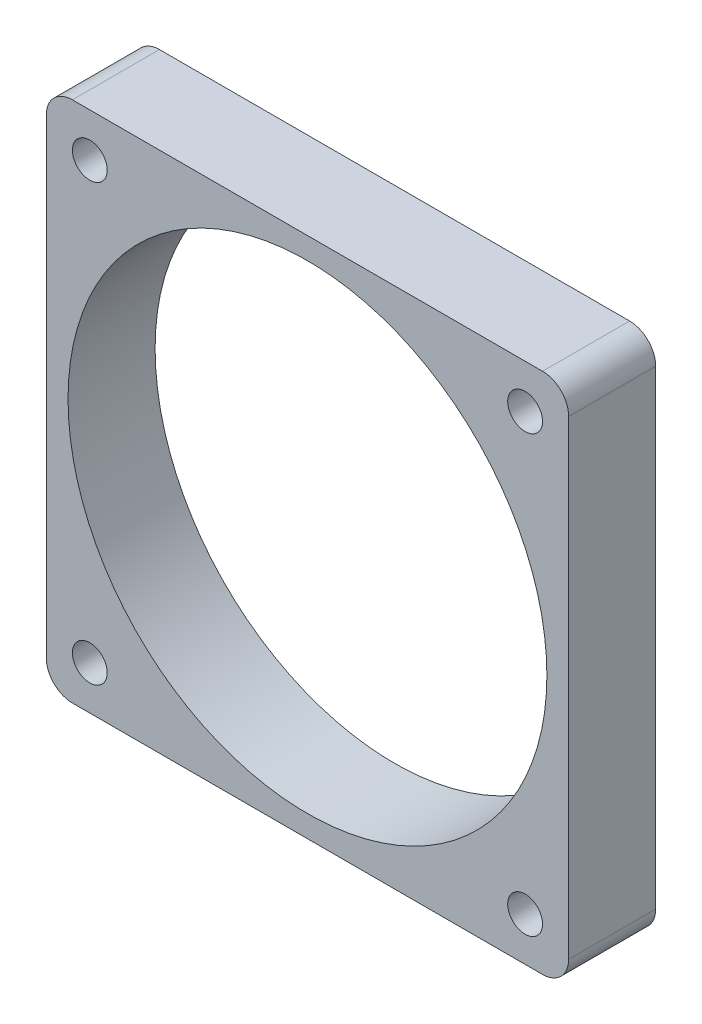
ISO-10303-21;
HEADER;
FILE_DESCRIPTION(('STEP AP214'),'2;1');
FILE_NAME('part.step','',(''),(''),'','','');
FILE_SCHEMA(('AUTOMOTIVE_DESIGN { 1 0 10303 214 1 1 1 1 }'));
ENDSEC;
DATA;
#1=APPLICATION_CONTEXT('core data for automotive mechanical design processes');
#2=APPLICATION_PROTOCOL_DEFINITION('international standard','automotive_design',2000,#1);
#3=PRODUCT_CONTEXT('',#1,'mechanical');
#4=PRODUCT('Part','Part','',(#3));
#5=PRODUCT_RELATED_PRODUCT_CATEGORY('part','',(#4));
#6=PRODUCT_DEFINITION_FORMATION('','',#4);
#7=PRODUCT_DEFINITION_CONTEXT('part definition',#1,'design');
#8=PRODUCT_DEFINITION('design','',#6,#7);
#9=PRODUCT_DEFINITION_SHAPE('','',#8);
#10=(LENGTH_UNIT() NAMED_UNIT(*) SI_UNIT(.MILLI.,.METRE.));
#11=(NAMED_UNIT(*) PLANE_ANGLE_UNIT() SI_UNIT($,.RADIAN.));
#12=(NAMED_UNIT(*) SI_UNIT($,.STERADIAN.) SOLID_ANGLE_UNIT());
#13=UNCERTAINTY_MEASURE_WITH_UNIT(LENGTH_MEASURE(1.E-05),#10,'distance_accuracy_value','');
#14=(GEOMETRIC_REPRESENTATION_CONTEXT(3) GLOBAL_UNCERTAINTY_ASSIGNED_CONTEXT((#13)) GLOBAL_UNIT_ASSIGNED_CONTEXT((#10,
#11,#12)) REPRESENTATION_CONTEXT('',''));
#15=CARTESIAN_POINT('',(0.,0.,0.));
#16=DIRECTION('',(0.,0.,1.));
#17=DIRECTION('',(1.,0.,0.));
#18=AXIS2_PLACEMENT_3D('',#15,#16,#17);
#19=CARTESIAN_POINT('',(0.,0.,10.));
#20=DIRECTION('',(0.,0.,-1.));
#21=DIRECTION('',(-1.,0.,0.));
#22=AXIS2_PLACEMENT_3D('',#19,#20,#21);
#23=PLANE('',#22);
#24=CARTESIAN_POINT('',(25.,25.,10.));
#25=DIRECTION('',(0.,0.,1.));
#26=DIRECTION('',(1.,0.,0.));
#27=AXIS2_PLACEMENT_3D('',#24,#25,#26);
#28=CIRCLE('',#27,2.);
#29=CARTESIAN_POINT('',(27.,25.,10.));
#30=VERTEX_POINT('',#29);
#31=EDGE_CURVE('E184',#30,#30,#28,.T.);
#32=ORIENTED_EDGE('',*,*,#31,.F.);
#33=EDGE_LOOP('',(#32));
#34=FACE_BOUND('',#33,.T.);
#35=CARTESIAN_POINT('',(-25.,-25.,10.));
#36=DIRECTION('',(0.,0.,1.));
#37=DIRECTION('',(1.,0.,0.));
#38=AXIS2_PLACEMENT_3D('',#35,#36,#37);
#39=CIRCLE('',#38,2.);
#40=CARTESIAN_POINT('',(-23.,-25.,10.));
#41=VERTEX_POINT('',#40);
#42=EDGE_CURVE('E176',#41,#41,#39,.T.);
#43=ORIENTED_EDGE('',*,*,#42,.F.);
#44=EDGE_LOOP('',(#43));
#45=FACE_BOUND('',#44,.T.);
#46=CARTESIAN_POINT('',(25.,-25.,10.));
#47=DIRECTION('',(0.,0.,1.));
#48=DIRECTION('',(1.,0.,0.));
#49=AXIS2_PLACEMENT_3D('',#46,#47,#48);
#50=CIRCLE('',#49,2.);
#51=CARTESIAN_POINT('',(27.,-25.,10.));
#52=VERTEX_POINT('',#51);
#53=EDGE_CURVE('E174',#52,#52,#50,.T.);
#54=ORIENTED_EDGE('',*,*,#53,.F.);
#55=EDGE_LOOP('',(#54));
#56=FACE_BOUND('',#55,.T.);
#57=CARTESIAN_POINT('',(-25.,25.,10.));
#58=DIRECTION('',(0.,0.,1.));
#59=DIRECTION('',(1.,0.,0.));
#60=AXIS2_PLACEMENT_3D('',#57,#58,#59);
#61=CIRCLE('',#60,2.);
#62=CARTESIAN_POINT('',(-23.,25.,10.));
#63=VERTEX_POINT('',#62);
#64=EDGE_CURVE('E170',#63,#63,#61,.T.);
#65=ORIENTED_EDGE('',*,*,#64,.F.);
#66=EDGE_LOOP('',(#65));
#67=FACE_BOUND('',#66,.T.);
#68=DIRECTION('',(1.,0.,0.));
#69=VECTOR('',#68,1.);
#70=CARTESIAN_POINT('',(-30.,-30.,10.));
#71=LINE('',#70,#69);
#72=CARTESIAN_POINT('',(-27.,-30.,10.));
#73=VERTEX_POINT('',#72);
#74=CARTESIAN_POINT('',(27.,-30.,10.));
#75=VERTEX_POINT('',#74);
#76=EDGE_CURVE('E120',#73,#75,#71,.T.);
#77=ORIENTED_EDGE('',*,*,#76,.T.);
#78=CARTESIAN_POINT('',(27.,-27.,10.));
#79=DIRECTION('',(0.,0.,-1.));
#80=DIRECTION('',(-1.,0.,0.));
#81=AXIS2_PLACEMENT_3D('',#78,#79,#80);
#82=CIRCLE('',#81,3.);
#83=CARTESIAN_POINT('',(30.,-27.,10.));
#84=VERTEX_POINT('',#83);
#85=EDGE_CURVE('E137',#75,#84,#82,.F.);
#86=ORIENTED_EDGE('',*,*,#85,.T.);
#87=DIRECTION('',(0.,1.,0.));
#88=VECTOR('',#87,1.);
#89=CARTESIAN_POINT('',(30.,-30.,10.));
#90=LINE('',#89,#88);
#91=CARTESIAN_POINT('',(30.,27.,10.));
#92=VERTEX_POINT('',#91);
#93=EDGE_CURVE('E103',#84,#92,#90,.T.);
#94=ORIENTED_EDGE('',*,*,#93,.T.);
#95=CARTESIAN_POINT('',(27.,27.,10.));
#96=DIRECTION('',(0.,0.,-1.));
#97=DIRECTION('',(-1.,0.,0.));
#98=AXIS2_PLACEMENT_3D('',#95,#96,#97);
#99=CIRCLE('',#98,3.);
#100=CARTESIAN_POINT('',(27.,30.,10.));
#101=VERTEX_POINT('',#100);
#102=EDGE_CURVE('E133',#92,#101,#99,.F.);
#103=ORIENTED_EDGE('',*,*,#102,.T.);
#104=DIRECTION('',(-1.,0.,0.));
#105=VECTOR('',#104,1.);
#106=CARTESIAN_POINT('',(-30.,30.,10.));
#107=LINE('',#106,#105);
#108=CARTESIAN_POINT('',(-27.,30.,10.));
#109=VERTEX_POINT('',#108);
#110=EDGE_CURVE('E147',#101,#109,#107,.T.);
#111=ORIENTED_EDGE('',*,*,#110,.T.);
#112=CARTESIAN_POINT('',(-27.,27.,10.));
#113=DIRECTION('',(0.,0.,-1.));
#114=DIRECTION('',(-1.,0.,0.));
#115=AXIS2_PLACEMENT_3D('',#112,#113,#114);
#116=CIRCLE('',#115,3.);
#117=CARTESIAN_POINT('',(-30.,27.,10.));
#118=VERTEX_POINT('',#117);
#119=EDGE_CURVE('E39',#109,#118,#116,.F.);
#120=ORIENTED_EDGE('',*,*,#119,.T.);
#121=DIRECTION('',(0.,-1.,0.));
#122=VECTOR('',#121,1.);
#123=CARTESIAN_POINT('',(-30.,-30.,10.));
#124=LINE('',#123,#122);
#125=CARTESIAN_POINT('',(-30.,-27.,10.));
#126=VERTEX_POINT('',#125);
#127=EDGE_CURVE('E158',#118,#126,#124,.T.);
#128=ORIENTED_EDGE('',*,*,#127,.T.);
#129=CARTESIAN_POINT('',(-27.,-27.,10.));
#130=DIRECTION('',(0.,0.,-1.));
#131=DIRECTION('',(-1.,0.,0.));
#132=AXIS2_PLACEMENT_3D('',#129,#130,#131);
#133=CIRCLE('',#132,3.);
#134=EDGE_CURVE('E140',#126,#73,#133,.F.);
#135=ORIENTED_EDGE('',*,*,#134,.T.);
#136=EDGE_LOOP('',(#77,#86,#94,#103,#111,#120,#128,#135));
#137=FACE_BOUND('',#136,.T.);
#138=CARTESIAN_POINT('',(0.,0.,10.));
#139=DIRECTION('',(0.,0.,1.));
#140=DIRECTION('',(1.,0.,0.));
#141=AXIS2_PLACEMENT_3D('',#138,#139,#140);
#142=CIRCLE('',#141,27.5);
#143=CARTESIAN_POINT('',(27.5,0.,10.));
#144=VERTEX_POINT('',#143);
#145=EDGE_CURVE('E112',#144,#144,#142,.T.);
#146=ORIENTED_EDGE('',*,*,#145,.F.);
#147=EDGE_LOOP('',(#146));
#148=FACE_BOUND('',#147,.T.);
#149=ADVANCED_FACE('F17',(#34,#45,#56,#67,#137,#148),#23,.F.);
#150=CARTESIAN_POINT('',(0.,0.,0.));
#151=DIRECTION('',(0.,0.,-1.));
#152=DIRECTION('',(-1.,0.,0.));
#153=AXIS2_PLACEMENT_3D('',#150,#151,#152);
#154=PLANE('',#153);
#155=CARTESIAN_POINT('',(25.,25.,0.));
#156=DIRECTION('',(0.,0.,1.));
#157=DIRECTION('',(1.,0.,0.));
#158=AXIS2_PLACEMENT_3D('',#155,#156,#157);
#159=CIRCLE('',#158,2.);
#160=CARTESIAN_POINT('',(27.,25.,0.));
#161=VERTEX_POINT('',#160);
#162=EDGE_CURVE('E168',#161,#161,#159,.T.);
#163=ORIENTED_EDGE('',*,*,#162,.T.);
#164=EDGE_LOOP('',(#163));
#165=FACE_BOUND('',#164,.T.);
#166=CARTESIAN_POINT('',(-25.,-25.,0.));
#167=DIRECTION('',(0.,0.,1.));
#168=DIRECTION('',(1.,0.,0.));
#169=AXIS2_PLACEMENT_3D('',#166,#167,#168);
#170=CIRCLE('',#169,2.);
#171=CARTESIAN_POINT('',(-23.,-25.,0.));
#172=VERTEX_POINT('',#171);
#173=EDGE_CURVE('E181',#172,#172,#170,.T.);
#174=ORIENTED_EDGE('',*,*,#173,.T.);
#175=EDGE_LOOP('',(#174));
#176=FACE_BOUND('',#175,.T.);
#177=CARTESIAN_POINT('',(25.,-25.,0.));
#178=DIRECTION('',(0.,0.,1.));
#179=DIRECTION('',(1.,0.,0.));
#180=AXIS2_PLACEMENT_3D('',#177,#178,#179);
#181=CIRCLE('',#180,2.);
#182=CARTESIAN_POINT('',(27.,-25.,0.));
#183=VERTEX_POINT('',#182);
#184=EDGE_CURVE('E177',#183,#183,#181,.T.);
#185=ORIENTED_EDGE('',*,*,#184,.T.);
#186=EDGE_LOOP('',(#185));
#187=FACE_BOUND('',#186,.T.);
#188=CARTESIAN_POINT('',(-25.,25.,0.));
#189=DIRECTION('',(0.,0.,1.));
#190=DIRECTION('',(1.,0.,0.));
#191=AXIS2_PLACEMENT_3D('',#188,#189,#190);
#192=CIRCLE('',#191,2.);
#193=CARTESIAN_POINT('',(-23.,25.,0.));
#194=VERTEX_POINT('',#193);
#195=EDGE_CURVE('E164',#194,#194,#192,.T.);
#196=ORIENTED_EDGE('',*,*,#195,.T.);
#197=EDGE_LOOP('',(#196));
#198=FACE_BOUND('',#197,.T.);
#199=DIRECTION('',(0.,1.,0.));
#200=VECTOR('',#199,1.);
#201=CARTESIAN_POINT('',(30.,-30.,0.));
#202=LINE('',#201,#200);
#203=CARTESIAN_POINT('',(30.,-27.,0.));
#204=VERTEX_POINT('',#203);
#205=CARTESIAN_POINT('',(30.,27.,0.));
#206=VERTEX_POINT('',#205);
#207=EDGE_CURVE('E99',#204,#206,#202,.T.);
#208=ORIENTED_EDGE('',*,*,#207,.F.);
#209=CARTESIAN_POINT('',(27.,-27.,0.));
#210=DIRECTION('',(0.,0.,-1.));
#211=DIRECTION('',(-1.,0.,0.));
#212=AXIS2_PLACEMENT_3D('',#209,#210,#211);
#213=CIRCLE('',#212,3.);
#214=CARTESIAN_POINT('',(27.,-30.,0.));
#215=VERTEX_POINT('',#214);
#216=EDGE_CURVE('E83',#204,#215,#213,.T.);
#217=ORIENTED_EDGE('',*,*,#216,.T.);
#218=DIRECTION('',(1.,0.,0.));
#219=VECTOR('',#218,1.);
#220=CARTESIAN_POINT('',(-30.,-30.,0.));
#221=LINE('',#220,#219);
#222=CARTESIAN_POINT('',(-27.,-30.,0.));
#223=VERTEX_POINT('',#222);
#224=EDGE_CURVE('E121',#223,#215,#221,.T.);
#225=ORIENTED_EDGE('',*,*,#224,.F.);
#226=CARTESIAN_POINT('',(-27.,-27.,0.));
#227=DIRECTION('',(0.,0.,-1.));
#228=DIRECTION('',(-1.,0.,0.));
#229=AXIS2_PLACEMENT_3D('',#226,#227,#228);
#230=CIRCLE('',#229,3.);
#231=CARTESIAN_POINT('',(-30.,-27.,0.));
#232=VERTEX_POINT('',#231);
#233=EDGE_CURVE('E94',#223,#232,#230,.T.);
#234=ORIENTED_EDGE('',*,*,#233,.T.);
#235=DIRECTION('',(0.,-1.,0.));
#236=VECTOR('',#235,1.);
#237=CARTESIAN_POINT('',(-30.,-30.,0.));
#238=LINE('',#237,#236);
#239=CARTESIAN_POINT('',(-30.,27.,0.));
#240=VERTEX_POINT('',#239);
#241=EDGE_CURVE('E111',#240,#232,#238,.T.);
#242=ORIENTED_EDGE('',*,*,#241,.F.);
#243=CARTESIAN_POINT('',(-27.,27.,0.));
#244=DIRECTION('',(0.,0.,-1.));
#245=DIRECTION('',(-1.,0.,0.));
#246=AXIS2_PLACEMENT_3D('',#243,#244,#245);
#247=CIRCLE('',#246,3.);
#248=CARTESIAN_POINT('',(-27.,30.,0.));
#249=VERTEX_POINT('',#248);
#250=EDGE_CURVE('E128',#240,#249,#247,.T.);
#251=ORIENTED_EDGE('',*,*,#250,.T.);
#252=DIRECTION('',(-1.,0.,0.));
#253=VECTOR('',#252,1.);
#254=CARTESIAN_POINT('',(-30.,30.,0.));
#255=LINE('',#254,#253);
#256=CARTESIAN_POINT('',(27.,30.,0.));
#257=VERTEX_POINT('',#256);
#258=EDGE_CURVE('E109',#257,#249,#255,.T.);
#259=ORIENTED_EDGE('',*,*,#258,.F.);
#260=CARTESIAN_POINT('',(27.,27.,0.));
#261=DIRECTION('',(0.,0.,-1.));
#262=DIRECTION('',(-1.,0.,0.));
#263=AXIS2_PLACEMENT_3D('',#260,#261,#262);
#264=CIRCLE('',#263,3.);
#265=EDGE_CURVE('E102',#257,#206,#264,.T.);
#266=ORIENTED_EDGE('',*,*,#265,.T.);
#267=EDGE_LOOP('',(#208,#217,#225,#234,#242,#251,#259,#266));
#268=FACE_BOUND('',#267,.T.);
#269=CARTESIAN_POINT('',(0.,0.,0.));
#270=DIRECTION('',(0.,0.,1.));
#271=DIRECTION('',(1.,0.,0.));
#272=AXIS2_PLACEMENT_3D('',#269,#270,#271);
#273=CIRCLE('',#272,27.5);
#274=CARTESIAN_POINT('',(27.5,0.,0.));
#275=VERTEX_POINT('',#274);
#276=EDGE_CURVE('E117',#275,#275,#273,.T.);
#277=ORIENTED_EDGE('',*,*,#276,.T.);
#278=EDGE_LOOP('',(#277));
#279=FACE_BOUND('',#278,.T.);
#280=ADVANCED_FACE('F110',(#165,#176,#187,#198,#268,#279),#154,.T.);
#281=CARTESIAN_POINT('',(30.,-30.,10.));
#282=DIRECTION('',(-1.,0.,0.));
#283=DIRECTION('',(0.,0.,1.));
#284=AXIS2_PLACEMENT_3D('',#281,#282,#283);
#285=PLANE('',#284);
#286=ORIENTED_EDGE('',*,*,#93,.F.);
#287=DIRECTION('',(0.,0.,-1.));
#288=VECTOR('',#287,1.);
#289=CARTESIAN_POINT('',(30.,-27.,10.));
#290=LINE('',#289,#288);
#291=EDGE_CURVE('E87',#84,#204,#290,.T.);
#292=ORIENTED_EDGE('',*,*,#291,.T.);
#293=ORIENTED_EDGE('',*,*,#207,.T.);
#294=DIRECTION('',(0.,0.,-1.));
#295=VECTOR('',#294,1.);
#296=CARTESIAN_POINT('',(30.,27.,10.));
#297=LINE('',#296,#295);
#298=EDGE_CURVE('E104',#206,#92,#297,.F.);
#299=ORIENTED_EDGE('',*,*,#298,.T.);
#300=EDGE_LOOP('',(#286,#292,#293,#299));
#301=FACE_BOUND('',#300,.T.);
#302=ADVANCED_FACE('F97',(#301),#285,.F.);
#303=CARTESIAN_POINT('',(-30.,30.,10.));
#304=DIRECTION('',(0.,-1.,0.));
#305=DIRECTION('',(0.,0.,-1.));
#306=AXIS2_PLACEMENT_3D('',#303,#304,#305);
#307=PLANE('',#306);
#308=ORIENTED_EDGE('',*,*,#258,.T.);
#309=DIRECTION('',(0.,0.,-1.));
#310=VECTOR('',#309,1.);
#311=CARTESIAN_POINT('',(-27.,30.,10.));
#312=LINE('',#311,#310);
#313=EDGE_CURVE('E11',#249,#109,#312,.F.);
#314=ORIENTED_EDGE('',*,*,#313,.T.);
#315=ORIENTED_EDGE('',*,*,#110,.F.);
#316=DIRECTION('',(0.,0.,-1.));
#317=VECTOR('',#316,1.);
#318=CARTESIAN_POINT('',(27.,30.,10.));
#319=LINE('',#318,#317);
#320=EDGE_CURVE('E25',#101,#257,#319,.T.);
#321=ORIENTED_EDGE('',*,*,#320,.T.);
#322=EDGE_LOOP('',(#308,#314,#315,#321));
#323=FACE_BOUND('',#322,.T.);
#324=ADVANCED_FACE('F146',(#323),#307,.F.);
#325=CARTESIAN_POINT('',(-30.,-30.,10.));
#326=DIRECTION('',(1.,0.,0.));
#327=DIRECTION('',(0.,0.,-1.));
#328=AXIS2_PLACEMENT_3D('',#325,#326,#327);
#329=PLANE('',#328);
#330=ORIENTED_EDGE('',*,*,#241,.T.);
#331=DIRECTION('',(0.,0.,-1.));
#332=VECTOR('',#331,1.);
#333=CARTESIAN_POINT('',(-30.,-27.,10.));
#334=LINE('',#333,#332);
#335=EDGE_CURVE('E32',#232,#126,#334,.F.);
#336=ORIENTED_EDGE('',*,*,#335,.T.);
#337=ORIENTED_EDGE('',*,*,#127,.F.);
#338=DIRECTION('',(0.,0.,-1.));
#339=VECTOR('',#338,1.);
#340=CARTESIAN_POINT('',(-30.,27.,10.));
#341=LINE('',#340,#339);
#342=EDGE_CURVE('E143',#118,#240,#341,.T.);
#343=ORIENTED_EDGE('',*,*,#342,.T.);
#344=EDGE_LOOP('',(#330,#336,#337,#343));
#345=FACE_BOUND('',#344,.T.);
#346=ADVANCED_FACE('F160',(#345),#329,.F.);
#347=CARTESIAN_POINT('',(-30.,-30.,10.));
#348=DIRECTION('',(0.,1.,0.));
#349=DIRECTION('',(0.,0.,1.));
#350=AXIS2_PLACEMENT_3D('',#347,#348,#349);
#351=PLANE('',#350);
#352=ORIENTED_EDGE('',*,*,#224,.T.);
#353=DIRECTION('',(0.,0.,-1.));
#354=VECTOR('',#353,1.);
#355=CARTESIAN_POINT('',(27.,-30.,10.));
#356=LINE('',#355,#354);
#357=EDGE_CURVE('E86',#215,#75,#356,.F.);
#358=ORIENTED_EDGE('',*,*,#357,.T.);
#359=ORIENTED_EDGE('',*,*,#76,.F.);
#360=DIRECTION('',(0.,0.,-1.));
#361=VECTOR('',#360,1.);
#362=CARTESIAN_POINT('',(-27.,-30.,10.));
#363=LINE('',#362,#361);
#364=EDGE_CURVE('E91',#73,#223,#363,.T.);
#365=ORIENTED_EDGE('',*,*,#364,.T.);
#366=EDGE_LOOP('',(#352,#358,#359,#365));
#367=FACE_BOUND('',#366,.T.);
#368=ADVANCED_FACE('F214',(#367),#351,.F.);
#369=CARTESIAN_POINT('',(0.,0.,10.));
#370=DIRECTION('',(0.,0.,-1.));
#371=DIRECTION('',(-1.,0.,0.));
#372=AXIS2_PLACEMENT_3D('',#369,#370,#371);
#373=CYLINDRICAL_SURFACE('',#372,27.5);
#374=ORIENTED_EDGE('',*,*,#145,.T.);
#375=EDGE_LOOP('',(#374));
#376=FACE_BOUND('',#375,.T.);
#377=ORIENTED_EDGE('',*,*,#276,.F.);
#378=EDGE_LOOP('',(#377));
#379=FACE_BOUND('',#378,.T.);
#380=ADVANCED_FACE('F215',(#376,#379),#373,.F.);
#381=CARTESIAN_POINT('',(27.,-27.,10.));
#382=DIRECTION('',(0.,0.,-1.));
#383=DIRECTION('',(-1.,0.,0.));
#384=AXIS2_PLACEMENT_3D('',#381,#382,#383);
#385=CYLINDRICAL_SURFACE('',#384,3.);
#386=ORIENTED_EDGE('',*,*,#85,.F.);
#387=ORIENTED_EDGE('',*,*,#357,.F.);
#388=ORIENTED_EDGE('',*,*,#216,.F.);
#389=ORIENTED_EDGE('',*,*,#291,.F.);
#390=EDGE_LOOP('',(#386,#387,#388,#389));
#391=FACE_BOUND('',#390,.T.);
#392=ADVANCED_FACE('F88',(#391),#385,.T.);
#393=CARTESIAN_POINT('',(-27.,-27.,10.));
#394=DIRECTION('',(0.,0.,-1.));
#395=DIRECTION('',(-1.,0.,0.));
#396=AXIS2_PLACEMENT_3D('',#393,#394,#395);
#397=CYLINDRICAL_SURFACE('',#396,3.);
#398=ORIENTED_EDGE('',*,*,#134,.F.);
#399=ORIENTED_EDGE('',*,*,#335,.F.);
#400=ORIENTED_EDGE('',*,*,#233,.F.);
#401=ORIENTED_EDGE('',*,*,#364,.F.);
#402=EDGE_LOOP('',(#398,#399,#400,#401));
#403=FACE_BOUND('',#402,.T.);
#404=ADVANCED_FACE('F240',(#403),#397,.T.);
#405=CARTESIAN_POINT('',(-27.,27.,10.));
#406=DIRECTION('',(0.,0.,-1.));
#407=DIRECTION('',(-1.,0.,0.));
#408=AXIS2_PLACEMENT_3D('',#405,#406,#407);
#409=CYLINDRICAL_SURFACE('',#408,3.);
#410=ORIENTED_EDGE('',*,*,#119,.F.);
#411=ORIENTED_EDGE('',*,*,#313,.F.);
#412=ORIENTED_EDGE('',*,*,#250,.F.);
#413=ORIENTED_EDGE('',*,*,#342,.F.);
#414=EDGE_LOOP('',(#410,#411,#412,#413));
#415=FACE_BOUND('',#414,.T.);
#416=ADVANCED_FACE('F156',(#415),#409,.T.);
#417=CARTESIAN_POINT('',(27.,27.,10.));
#418=DIRECTION('',(0.,0.,-1.));
#419=DIRECTION('',(-1.,0.,0.));
#420=AXIS2_PLACEMENT_3D('',#417,#418,#419);
#421=CYLINDRICAL_SURFACE('',#420,3.);
#422=ORIENTED_EDGE('',*,*,#102,.F.);
#423=ORIENTED_EDGE('',*,*,#298,.F.);
#424=ORIENTED_EDGE('',*,*,#265,.F.);
#425=ORIENTED_EDGE('',*,*,#320,.F.);
#426=EDGE_LOOP('',(#422,#423,#424,#425));
#427=FACE_BOUND('',#426,.T.);
#428=ADVANCED_FACE('F19',(#427),#421,.T.);
#429=CARTESIAN_POINT('',(-25.,25.,0.));
#430=DIRECTION('',(0.,0.,1.));
#431=DIRECTION('',(1.,0.,0.));
#432=AXIS2_PLACEMENT_3D('',#429,#430,#431);
#433=CYLINDRICAL_SURFACE('',#432,2.);
#434=ORIENTED_EDGE('',*,*,#195,.F.);
#435=EDGE_LOOP('',(#434));
#436=FACE_BOUND('',#435,.T.);
#437=ORIENTED_EDGE('',*,*,#64,.T.);
#438=EDGE_LOOP('',(#437));
#439=FACE_BOUND('',#438,.T.);
#440=ADVANCED_FACE('F243',(#436,#439),#433,.F.);
#441=CARTESIAN_POINT('',(25.,-25.,0.));
#442=DIRECTION('',(0.,0.,1.));
#443=DIRECTION('',(1.,0.,0.));
#444=AXIS2_PLACEMENT_3D('',#441,#442,#443);
#445=CYLINDRICAL_SURFACE('',#444,2.);
#446=ORIENTED_EDGE('',*,*,#184,.F.);
#447=EDGE_LOOP('',(#446));
#448=FACE_BOUND('',#447,.T.);
#449=ORIENTED_EDGE('',*,*,#53,.T.);
#450=EDGE_LOOP('',(#449));
#451=FACE_BOUND('',#450,.T.);
#452=ADVANCED_FACE('F247',(#448,#451),#445,.F.);
#453=CARTESIAN_POINT('',(-25.,-25.,0.));
#454=DIRECTION('',(0.,0.,1.));
#455=DIRECTION('',(1.,0.,0.));
#456=AXIS2_PLACEMENT_3D('',#453,#454,#455);
#457=CYLINDRICAL_SURFACE('',#456,2.);
#458=ORIENTED_EDGE('',*,*,#173,.F.);
#459=EDGE_LOOP('',(#458));
#460=FACE_BOUND('',#459,.T.);
#461=ORIENTED_EDGE('',*,*,#42,.T.);
#462=EDGE_LOOP('',(#461));
#463=FACE_BOUND('',#462,.T.);
#464=ADVANCED_FACE('F198',(#460,#463),#457,.F.);
#465=CARTESIAN_POINT('',(25.,25.,0.));
#466=DIRECTION('',(0.,0.,1.));
#467=DIRECTION('',(1.,0.,0.));
#468=AXIS2_PLACEMENT_3D('',#465,#466,#467);
#469=CYLINDRICAL_SURFACE('',#468,2.);
#470=ORIENTED_EDGE('',*,*,#162,.F.);
#471=EDGE_LOOP('',(#470));
#472=FACE_BOUND('',#471,.T.);
#473=ORIENTED_EDGE('',*,*,#31,.T.);
#474=EDGE_LOOP('',(#473));
#475=FACE_BOUND('',#474,.T.);
#476=ADVANCED_FACE('F193',(#472,#475),#469,.F.);
#477=CLOSED_SHELL('',(#149,#280,#302,#324,#346,#368,#380,#392,#404,#416,#428,#440,#452,#464,#476));
#478=MANIFOLD_SOLID_BREP('B1',#477);
#479=ADVANCED_BREP_SHAPE_REPRESENTATION('',(#18,#478),#14);
#480=SHAPE_DEFINITION_REPRESENTATION(#9,#479);
ENDSEC;
END-ISO-10303-21;
